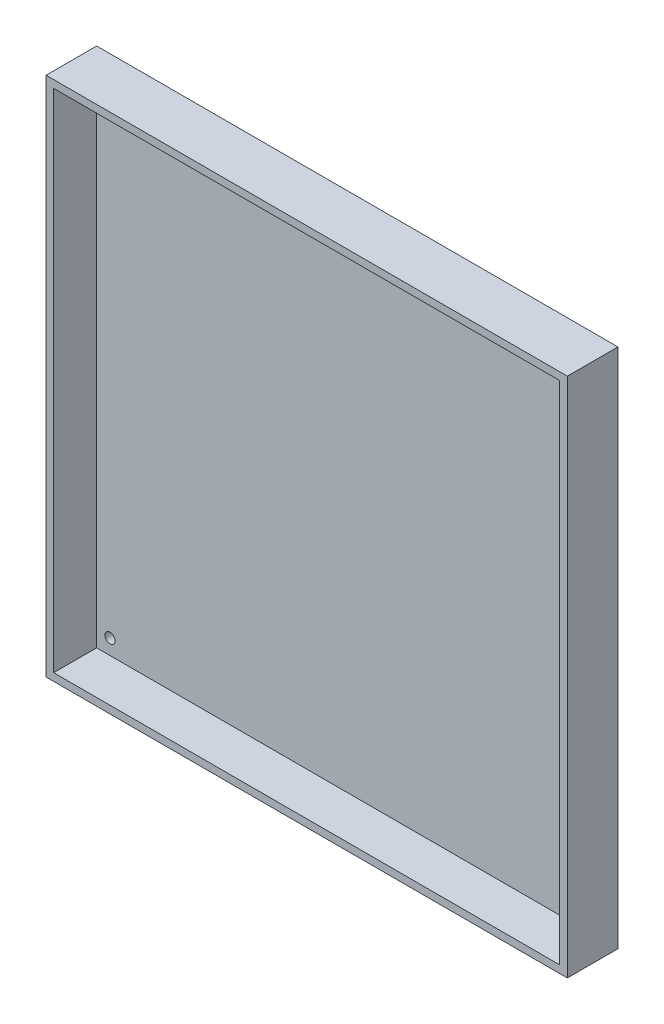
ISO-10303-21;
HEADER;
FILE_DESCRIPTION(('STEP AP214'),'2;1');
FILE_NAME('part.step','',(''),(''),'','','');
FILE_SCHEMA(('AUTOMOTIVE_DESIGN { 1 0 10303 214 1 1 1 1 }'));
ENDSEC;
DATA;
#1=APPLICATION_CONTEXT('core data for automotive mechanical design processes');
#2=APPLICATION_PROTOCOL_DEFINITION('international standard','automotive_design',2000,#1);
#3=PRODUCT_CONTEXT('',#1,'mechanical');
#4=PRODUCT('Part','Part','',(#3));
#5=PRODUCT_RELATED_PRODUCT_CATEGORY('part','',(#4));
#6=PRODUCT_DEFINITION_FORMATION('','',#4);
#7=PRODUCT_DEFINITION_CONTEXT('part definition',#1,'design');
#8=PRODUCT_DEFINITION('design','',#6,#7);
#9=PRODUCT_DEFINITION_SHAPE('','',#8);
#10=(LENGTH_UNIT() NAMED_UNIT(*) SI_UNIT(.MILLI.,.METRE.));
#11=(NAMED_UNIT(*) PLANE_ANGLE_UNIT() SI_UNIT($,.RADIAN.));
#12=(NAMED_UNIT(*) SI_UNIT($,.STERADIAN.) SOLID_ANGLE_UNIT());
#13=UNCERTAINTY_MEASURE_WITH_UNIT(LENGTH_MEASURE(1.E-05),#10,'distance_accuracy_value','');
#14=(GEOMETRIC_REPRESENTATION_CONTEXT(3) GLOBAL_UNCERTAINTY_ASSIGNED_CONTEXT((#13)) GLOBAL_UNIT_ASSIGNED_CONTEXT((#10,
#11,#12)) REPRESENTATION_CONTEXT('',''));
#15=CARTESIAN_POINT('',(0.,0.,0.));
#16=DIRECTION('',(0.,0.,1.));
#17=DIRECTION('',(1.,0.,0.));
#18=AXIS2_PLACEMENT_3D('',#15,#16,#17);
#19=CARTESIAN_POINT('',(0.,-103.,1.5));
#20=DIRECTION('',(1.,0.,0.));
#21=DIRECTION('',(0.,0.,-1.));
#22=AXIS2_PLACEMENT_3D('',#19,#20,#21);
#23=PLANE('',#22);
#24=DIRECTION('',(0.,-1.,0.));
#25=VECTOR('',#24,1.);
#26=CARTESIAN_POINT('',(0.,-103.,0.));
#27=LINE('',#26,#25);
#28=CARTESIAN_POINT('',(0.,0.,0.));
#29=VERTEX_POINT('',#28);
#30=CARTESIAN_POINT('',(0.,-103.,0.));
#31=VERTEX_POINT('',#30);
#32=EDGE_CURVE('E115',#29,#31,#27,.T.);
#33=ORIENTED_EDGE('',*,*,#32,.T.);
#34=DIRECTION('',(0.,0.,-1.));
#35=VECTOR('',#34,1.);
#36=CARTESIAN_POINT('',(0.,-103.,1.5));
#37=LINE('',#36,#35);
#38=CARTESIAN_POINT('',(0.,-103.,10.));
#39=VERTEX_POINT('',#38);
#40=EDGE_CURVE('E11',#39,#31,#37,.T.);
#41=ORIENTED_EDGE('',*,*,#40,.F.);
#42=DIRECTION('',(0.,-1.,0.));
#43=VECTOR('',#42,1.);
#44=CARTESIAN_POINT('',(0.,0.,10.));
#45=LINE('',#44,#43);
#46=CARTESIAN_POINT('',(0.,0.,10.));
#47=VERTEX_POINT('',#46);
#48=EDGE_CURVE('E139',#47,#39,#45,.T.);
#49=ORIENTED_EDGE('',*,*,#48,.F.);
#50=DIRECTION('',(0.,0.,-1.));
#51=VECTOR('',#50,1.);
#52=CARTESIAN_POINT('',(0.,0.,1.5));
#53=LINE('',#52,#51);
#54=EDGE_CURVE('E167',#47,#29,#53,.T.);
#55=ORIENTED_EDGE('',*,*,#54,.T.);
#56=EDGE_LOOP('',(#33,#41,#49,#55));
#57=FACE_BOUND('',#56,.T.);
#58=ADVANCED_FACE('F39',(#57),#23,.F.);
#59=CARTESIAN_POINT('',(103.,-103.,1.5));
#60=DIRECTION('',(0.,1.,0.));
#61=DIRECTION('',(-1.,0.,0.));
#62=AXIS2_PLACEMENT_3D('',#59,#60,#61);
#63=PLANE('',#62);
#64=DIRECTION('',(1.,0.,0.));
#65=VECTOR('',#64,1.);
#66=CARTESIAN_POINT('',(103.,-103.,0.));
#67=LINE('',#66,#65);
#68=CARTESIAN_POINT('',(103.,-103.,0.));
#69=VERTEX_POINT('',#68);
#70=EDGE_CURVE('E162',#31,#69,#67,.T.);
#71=ORIENTED_EDGE('',*,*,#70,.T.);
#72=DIRECTION('',(0.,0.,-1.));
#73=VECTOR('',#72,1.);
#74=CARTESIAN_POINT('',(103.,-103.,1.5));
#75=LINE('',#74,#73);
#76=CARTESIAN_POINT('',(103.,-103.,10.));
#77=VERTEX_POINT('',#76);
#78=EDGE_CURVE('E46',#77,#69,#75,.T.);
#79=ORIENTED_EDGE('',*,*,#78,.F.);
#80=DIRECTION('',(1.,0.,0.));
#81=VECTOR('',#80,1.);
#82=CARTESIAN_POINT('',(0.,-103.,10.));
#83=LINE('',#82,#81);
#84=EDGE_CURVE('E142',#39,#77,#83,.T.);
#85=ORIENTED_EDGE('',*,*,#84,.F.);
#86=ORIENTED_EDGE('',*,*,#40,.T.);
#87=EDGE_LOOP('',(#71,#79,#85,#86));
#88=FACE_BOUND('',#87,.T.);
#89=ADVANCED_FACE('F184',(#88),#63,.F.);
#90=CARTESIAN_POINT('',(103.,0.,1.5));
#91=DIRECTION('',(-1.,0.,0.));
#92=DIRECTION('',(0.,0.,1.));
#93=AXIS2_PLACEMENT_3D('',#90,#91,#92);
#94=PLANE('',#93);
#95=DIRECTION('',(0.,1.,0.));
#96=VECTOR('',#95,1.);
#97=CARTESIAN_POINT('',(103.,0.,0.));
#98=LINE('',#97,#96);
#99=CARTESIAN_POINT('',(103.,0.,0.));
#100=VERTEX_POINT('',#99);
#101=EDGE_CURVE('E164',#69,#100,#98,.T.);
#102=ORIENTED_EDGE('',*,*,#101,.T.);
#103=DIRECTION('',(0.,0.,-1.));
#104=VECTOR('',#103,1.);
#105=CARTESIAN_POINT('',(103.,0.,1.5));
#106=LINE('',#105,#104);
#107=CARTESIAN_POINT('',(103.,0.,10.));
#108=VERTEX_POINT('',#107);
#109=EDGE_CURVE('E169',#108,#100,#106,.T.);
#110=ORIENTED_EDGE('',*,*,#109,.F.);
#111=DIRECTION('',(0.,1.,0.));
#112=VECTOR('',#111,1.);
#113=CARTESIAN_POINT('',(103.,0.,10.));
#114=LINE('',#113,#112);
#115=EDGE_CURVE('E145',#77,#108,#114,.T.);
#116=ORIENTED_EDGE('',*,*,#115,.F.);
#117=ORIENTED_EDGE('',*,*,#78,.T.);
#118=EDGE_LOOP('',(#102,#110,#116,#117));
#119=FACE_BOUND('',#118,.T.);
#120=ADVANCED_FACE('F174',(#119),#94,.F.);
#121=CARTESIAN_POINT('',(0.,0.,1.5));
#122=DIRECTION('',(0.,-1.,0.));
#123=DIRECTION('',(0.,0.,-1.));
#124=AXIS2_PLACEMENT_3D('',#121,#122,#123);
#125=PLANE('',#124);
#126=DIRECTION('',(-1.,0.,0.));
#127=VECTOR('',#126,1.);
#128=CARTESIAN_POINT('',(0.,0.,0.));
#129=LINE('',#128,#127);
#130=EDGE_CURVE('E61',#100,#29,#129,.T.);
#131=ORIENTED_EDGE('',*,*,#130,.T.);
#132=ORIENTED_EDGE('',*,*,#54,.F.);
#133=DIRECTION('',(-1.,0.,0.));
#134=VECTOR('',#133,1.);
#135=CARTESIAN_POINT('',(0.,0.,10.));
#136=LINE('',#135,#134);
#137=EDGE_CURVE('E136',#108,#47,#136,.T.);
#138=ORIENTED_EDGE('',*,*,#137,.F.);
#139=ORIENTED_EDGE('',*,*,#109,.T.);
#140=EDGE_LOOP('',(#131,#132,#138,#139));
#141=FACE_BOUND('',#140,.T.);
#142=ADVANCED_FACE('F183',(#141),#125,.F.);
#143=CARTESIAN_POINT('',(0.,0.,0.));
#144=DIRECTION('',(0.,0.,-1.));
#145=DIRECTION('',(-1.,0.,0.));
#146=AXIS2_PLACEMENT_3D('',#143,#144,#145);
#147=PLANE('',#146);
#148=CARTESIAN_POINT('',(4.5,-4.5,0.));
#149=DIRECTION('',(0.,0.,1.));
#150=DIRECTION('',(1.,0.,0.));
#151=AXIS2_PLACEMENT_3D('',#148,#149,#150);
#152=CIRCLE('',#151,1.);
#153=CARTESIAN_POINT('',(5.5,-4.5,0.));
#154=VERTEX_POINT('',#153);
#155=EDGE_CURVE('E249',#154,#154,#152,.T.);
#156=ORIENTED_EDGE('',*,*,#155,.T.);
#157=EDGE_LOOP('',(#156));
#158=FACE_BOUND('',#157,.T.);
#159=CARTESIAN_POINT('',(98.5,-4.5,0.));
#160=DIRECTION('',(0.,0.,1.));
#161=DIRECTION('',(1.,0.,0.));
#162=AXIS2_PLACEMENT_3D('',#159,#160,#161);
#163=CIRCLE('',#162,0.999999999999998);
#164=CARTESIAN_POINT('',(99.5,-4.5,0.));
#165=VERTEX_POINT('',#164);
#166=EDGE_CURVE('E239',#165,#165,#163,.T.);
#167=ORIENTED_EDGE('',*,*,#166,.T.);
#168=EDGE_LOOP('',(#167));
#169=FACE_BOUND('',#168,.T.);
#170=CARTESIAN_POINT('',(98.5,-98.5,0.));
#171=DIRECTION('',(0.,0.,1.));
#172=DIRECTION('',(1.,0.,0.));
#173=AXIS2_PLACEMENT_3D('',#170,#171,#172);
#174=CIRCLE('',#173,0.999999999999998);
#175=CARTESIAN_POINT('',(99.5,-98.5,0.));
#176=VERTEX_POINT('',#175);
#177=EDGE_CURVE('E234',#176,#176,#174,.T.);
#178=ORIENTED_EDGE('',*,*,#177,.T.);
#179=EDGE_LOOP('',(#178));
#180=FACE_BOUND('',#179,.T.);
#181=CARTESIAN_POINT('',(4.12635577714582,-98.5,0.));
#182=DIRECTION('',(0.,0.,1.));
#183=DIRECTION('',(1.,0.,0.));
#184=AXIS2_PLACEMENT_3D('',#181,#182,#183);
#185=CIRCLE('',#184,1.);
#186=CARTESIAN_POINT('',(5.12635577714582,-98.5,0.));
#187=VERTEX_POINT('',#186);
#188=EDGE_CURVE('E151',#187,#187,#185,.T.);
#189=ORIENTED_EDGE('',*,*,#188,.T.);
#190=EDGE_LOOP('',(#189));
#191=FACE_BOUND('',#190,.T.);
#192=ORIENTED_EDGE('',*,*,#32,.F.);
#193=ORIENTED_EDGE('',*,*,#130,.F.);
#194=ORIENTED_EDGE('',*,*,#101,.F.);
#195=ORIENTED_EDGE('',*,*,#70,.F.);
#196=EDGE_LOOP('',(#192,#193,#194,#195));
#197=FACE_BOUND('',#196,.T.);
#198=ADVANCED_FACE('F179',(#158,#169,#180,#191,#197),#147,.T.);
#199=CARTESIAN_POINT('',(0.,-1.5,10.));
#200=DIRECTION('',(0.,-1.,0.));
#201=DIRECTION('',(0.,0.,-1.));
#202=AXIS2_PLACEMENT_3D('',#199,#200,#201);
#203=PLANE('',#202);
#204=DIRECTION('',(-1.,0.,0.));
#205=VECTOR('',#204,1.);
#206=CARTESIAN_POINT('',(0.,-1.5,1.5));
#207=LINE('',#206,#205);
#208=CARTESIAN_POINT('',(101.5,-1.5,1.5));
#209=VERTEX_POINT('',#208);
#210=CARTESIAN_POINT('',(1.5,-1.5,1.5));
#211=VERTEX_POINT('',#210);
#212=EDGE_CURVE('E110',#209,#211,#207,.T.);
#213=ORIENTED_EDGE('',*,*,#212,.F.);
#214=DIRECTION('',(0.,0.,-1.));
#215=VECTOR('',#214,1.);
#216=CARTESIAN_POINT('',(101.5,-1.5,10.));
#217=LINE('',#216,#215);
#218=CARTESIAN_POINT('',(101.5,-1.5,10.));
#219=VERTEX_POINT('',#218);
#220=EDGE_CURVE('E104',#219,#209,#217,.T.);
#221=ORIENTED_EDGE('',*,*,#220,.F.);
#222=DIRECTION('',(-1.,0.,0.));
#223=VECTOR('',#222,1.);
#224=CARTESIAN_POINT('',(0.,-1.5,10.));
#225=LINE('',#224,#223);
#226=CARTESIAN_POINT('',(1.5,-1.5,10.));
#227=VERTEX_POINT('',#226);
#228=EDGE_CURVE('E107',#219,#227,#225,.T.);
#229=ORIENTED_EDGE('',*,*,#228,.T.);
#230=DIRECTION('',(0.,0.,-1.));
#231=VECTOR('',#230,1.);
#232=CARTESIAN_POINT('',(1.5,-1.5,10.));
#233=LINE('',#232,#231);
#234=EDGE_CURVE('E148',#227,#211,#233,.T.);
#235=ORIENTED_EDGE('',*,*,#234,.T.);
#236=EDGE_LOOP('',(#213,#221,#229,#235));
#237=FACE_BOUND('',#236,.T.);
#238=ADVANCED_FACE('F106',(#237),#203,.T.);
#239=CARTESIAN_POINT('',(101.5,0.,10.));
#240=DIRECTION('',(-1.,0.,0.));
#241=DIRECTION('',(0.,0.,1.));
#242=AXIS2_PLACEMENT_3D('',#239,#240,#241);
#243=PLANE('',#242);
#244=DIRECTION('',(0.,1.,0.));
#245=VECTOR('',#244,1.);
#246=CARTESIAN_POINT('',(101.5,0.,1.5));
#247=LINE('',#246,#245);
#248=CARTESIAN_POINT('',(101.5,-101.5,1.5));
#249=VERTEX_POINT('',#248);
#250=EDGE_CURVE('E150',#249,#209,#247,.T.);
#251=ORIENTED_EDGE('',*,*,#250,.F.);
#252=DIRECTION('',(0.,0.,-1.));
#253=VECTOR('',#252,1.);
#254=CARTESIAN_POINT('',(101.5,-101.5,10.));
#255=LINE('',#254,#253);
#256=CARTESIAN_POINT('',(101.5,-101.5,10.));
#257=VERTEX_POINT('',#256);
#258=EDGE_CURVE('E116',#257,#249,#255,.T.);
#259=ORIENTED_EDGE('',*,*,#258,.F.);
#260=DIRECTION('',(0.,1.,0.));
#261=VECTOR('',#260,1.);
#262=CARTESIAN_POINT('',(101.5,0.,10.));
#263=LINE('',#262,#261);
#264=EDGE_CURVE('E123',#257,#219,#263,.T.);
#265=ORIENTED_EDGE('',*,*,#264,.T.);
#266=ORIENTED_EDGE('',*,*,#220,.T.);
#267=EDGE_LOOP('',(#251,#259,#265,#266));
#268=FACE_BOUND('',#267,.T.);
#269=ADVANCED_FACE('F129',(#268),#243,.T.);
#270=CARTESIAN_POINT('',(0.,-101.5,10.));
#271=DIRECTION('',(0.,1.,0.));
#272=DIRECTION('',(0.,0.,1.));
#273=AXIS2_PLACEMENT_3D('',#270,#271,#272);
#274=PLANE('',#273);
#275=DIRECTION('',(1.,0.,0.));
#276=VECTOR('',#275,1.);
#277=CARTESIAN_POINT('',(0.,-101.5,1.5));
#278=LINE('',#277,#276);
#279=CARTESIAN_POINT('',(1.50000000000001,-101.5,1.5));
#280=VERTEX_POINT('',#279);
#281=EDGE_CURVE('E53',#280,#249,#278,.T.);
#282=ORIENTED_EDGE('',*,*,#281,.F.);
#283=DIRECTION('',(0.,0.,-1.));
#284=VECTOR('',#283,1.);
#285=CARTESIAN_POINT('',(1.50000000000001,-101.5,10.));
#286=LINE('',#285,#284);
#287=CARTESIAN_POINT('',(1.50000000000001,-101.5,10.));
#288=VERTEX_POINT('',#287);
#289=EDGE_CURVE('E157',#288,#280,#286,.T.);
#290=ORIENTED_EDGE('',*,*,#289,.F.);
#291=DIRECTION('',(1.,0.,0.));
#292=VECTOR('',#291,1.);
#293=CARTESIAN_POINT('',(0.,-101.5,10.));
#294=LINE('',#293,#292);
#295=EDGE_CURVE('E130',#288,#257,#294,.T.);
#296=ORIENTED_EDGE('',*,*,#295,.T.);
#297=ORIENTED_EDGE('',*,*,#258,.T.);
#298=EDGE_LOOP('',(#282,#290,#296,#297));
#299=FACE_BOUND('',#298,.T.);
#300=ADVANCED_FACE('F206',(#299),#274,.T.);
#301=CARTESIAN_POINT('',(1.5,0.,10.));
#302=DIRECTION('',(1.,0.,0.));
#303=DIRECTION('',(0.,1.,0.));
#304=AXIS2_PLACEMENT_3D('',#301,#302,#303);
#305=PLANE('',#304);
#306=DIRECTION('',(0.,-1.,0.));
#307=VECTOR('',#306,1.);
#308=CARTESIAN_POINT('',(1.5,0.,1.5));
#309=LINE('',#308,#307);
#310=EDGE_CURVE('E127',#211,#280,#309,.T.);
#311=ORIENTED_EDGE('',*,*,#310,.F.);
#312=ORIENTED_EDGE('',*,*,#234,.F.);
#313=DIRECTION('',(0.,-1.,0.));
#314=VECTOR('',#313,1.);
#315=CARTESIAN_POINT('',(1.5,0.,10.));
#316=LINE('',#315,#314);
#317=EDGE_CURVE('E126',#227,#288,#316,.T.);
#318=ORIENTED_EDGE('',*,*,#317,.T.);
#319=ORIENTED_EDGE('',*,*,#289,.T.);
#320=EDGE_LOOP('',(#311,#312,#318,#319));
#321=FACE_BOUND('',#320,.T.);
#322=ADVANCED_FACE('F209',(#321),#305,.T.);
#323=CARTESIAN_POINT('',(0.,0.,10.));
#324=DIRECTION('',(0.,0.,1.));
#325=DIRECTION('',(1.,0.,0.));
#326=AXIS2_PLACEMENT_3D('',#323,#324,#325);
#327=PLANE('',#326);
#328=ORIENTED_EDGE('',*,*,#228,.F.);
#329=ORIENTED_EDGE('',*,*,#264,.F.);
#330=ORIENTED_EDGE('',*,*,#295,.F.);
#331=ORIENTED_EDGE('',*,*,#317,.F.);
#332=EDGE_LOOP('',(#328,#329,#330,#331));
#333=FACE_BOUND('',#332,.T.);
#334=ORIENTED_EDGE('',*,*,#137,.T.);
#335=ORIENTED_EDGE('',*,*,#48,.T.);
#336=ORIENTED_EDGE('',*,*,#84,.T.);
#337=ORIENTED_EDGE('',*,*,#115,.T.);
#338=EDGE_LOOP('',(#334,#335,#336,#337));
#339=FACE_BOUND('',#338,.T.);
#340=ADVANCED_FACE('F120',(#333,#339),#327,.T.);
#341=CARTESIAN_POINT('',(0.,0.,1.5));
#342=DIRECTION('',(0.,0.,-1.));
#343=DIRECTION('',(-1.,0.,0.));
#344=AXIS2_PLACEMENT_3D('',#341,#342,#343);
#345=PLANE('',#344);
#346=CARTESIAN_POINT('',(4.5,-4.5,1.5));
#347=DIRECTION('',(0.,0.,1.));
#348=DIRECTION('',(1.,0.,0.));
#349=AXIS2_PLACEMENT_3D('',#346,#347,#348);
#350=CIRCLE('',#349,1.);
#351=CARTESIAN_POINT('',(5.5,-4.5,1.5));
#352=VERTEX_POINT('',#351);
#353=EDGE_CURVE('E252',#352,#352,#350,.T.);
#354=ORIENTED_EDGE('',*,*,#353,.F.);
#355=EDGE_LOOP('',(#354));
#356=FACE_BOUND('',#355,.T.);
#357=CARTESIAN_POINT('',(98.5,-4.5,1.5));
#358=DIRECTION('',(0.,0.,1.));
#359=DIRECTION('',(1.,0.,0.));
#360=AXIS2_PLACEMENT_3D('',#357,#358,#359);
#361=CIRCLE('',#360,0.999999999999998);
#362=CARTESIAN_POINT('',(99.5,-4.5,1.5));
#363=VERTEX_POINT('',#362);
#364=EDGE_CURVE('E244',#363,#363,#361,.T.);
#365=ORIENTED_EDGE('',*,*,#364,.F.);
#366=EDGE_LOOP('',(#365));
#367=FACE_BOUND('',#366,.T.);
#368=CARTESIAN_POINT('',(98.5,-98.5,1.5));
#369=DIRECTION('',(0.,0.,1.));
#370=DIRECTION('',(1.,0.,0.));
#371=AXIS2_PLACEMENT_3D('',#368,#369,#370);
#372=CIRCLE('',#371,0.999999999999998);
#373=CARTESIAN_POINT('',(99.5,-98.5,1.5));
#374=VERTEX_POINT('',#373);
#375=EDGE_CURVE('E237',#374,#374,#372,.T.);
#376=ORIENTED_EDGE('',*,*,#375,.F.);
#377=EDGE_LOOP('',(#376));
#378=FACE_BOUND('',#377,.T.);
#379=CARTESIAN_POINT('',(4.12635577714582,-98.5,1.5));
#380=DIRECTION('',(0.,0.,1.));
#381=DIRECTION('',(1.,0.,0.));
#382=AXIS2_PLACEMENT_3D('',#379,#380,#381);
#383=CIRCLE('',#382,1.);
#384=CARTESIAN_POINT('',(5.12635577714582,-98.5,1.5));
#385=VERTEX_POINT('',#384);
#386=EDGE_CURVE('E241',#385,#385,#383,.T.);
#387=ORIENTED_EDGE('',*,*,#386,.F.);
#388=EDGE_LOOP('',(#387));
#389=FACE_BOUND('',#388,.T.);
#390=ORIENTED_EDGE('',*,*,#250,.T.);
#391=ORIENTED_EDGE('',*,*,#212,.T.);
#392=ORIENTED_EDGE('',*,*,#310,.T.);
#393=ORIENTED_EDGE('',*,*,#281,.T.);
#394=EDGE_LOOP('',(#390,#391,#392,#393));
#395=FACE_BOUND('',#394,.T.);
#396=ADVANCED_FACE('F197',(#356,#367,#378,#389,#395),#345,.F.);
#397=CARTESIAN_POINT('',(4.12635577714582,-98.5,0.));
#398=DIRECTION('',(0.,0.,1.));
#399=DIRECTION('',(1.,0.,0.));
#400=AXIS2_PLACEMENT_3D('',#397,#398,#399);
#401=CYLINDRICAL_SURFACE('',#400,1.);
#402=ORIENTED_EDGE('',*,*,#188,.F.);
#403=EDGE_LOOP('',(#402));
#404=FACE_BOUND('',#403,.T.);
#405=ORIENTED_EDGE('',*,*,#386,.T.);
#406=EDGE_LOOP('',(#405));
#407=FACE_BOUND('',#406,.T.);
#408=ADVANCED_FACE('F200',(#404,#407),#401,.F.);
#409=CARTESIAN_POINT('',(98.5,-98.5,0.));
#410=DIRECTION('',(0.,0.,1.));
#411=DIRECTION('',(1.,0.,0.));
#412=AXIS2_PLACEMENT_3D('',#409,#410,#411);
#413=CYLINDRICAL_SURFACE('',#412,0.999999999999998);
#414=ORIENTED_EDGE('',*,*,#177,.F.);
#415=EDGE_LOOP('',(#414));
#416=FACE_BOUND('',#415,.T.);
#417=ORIENTED_EDGE('',*,*,#375,.T.);
#418=EDGE_LOOP('',(#417));
#419=FACE_BOUND('',#418,.T.);
#420=ADVANCED_FACE('F217',(#416,#419),#413,.F.);
#421=CARTESIAN_POINT('',(98.5,-4.5,0.));
#422=DIRECTION('',(0.,0.,1.));
#423=DIRECTION('',(1.,0.,0.));
#424=AXIS2_PLACEMENT_3D('',#421,#422,#423);
#425=CYLINDRICAL_SURFACE('',#424,0.999999999999998);
#426=ORIENTED_EDGE('',*,*,#166,.F.);
#427=EDGE_LOOP('',(#426));
#428=FACE_BOUND('',#427,.T.);
#429=ORIENTED_EDGE('',*,*,#364,.T.);
#430=EDGE_LOOP('',(#429));
#431=FACE_BOUND('',#430,.T.);
#432=ADVANCED_FACE('F222',(#428,#431),#425,.F.);
#433=CARTESIAN_POINT('',(4.5,-4.5,0.));
#434=DIRECTION('',(0.,0.,1.));
#435=DIRECTION('',(1.,0.,0.));
#436=AXIS2_PLACEMENT_3D('',#433,#434,#435);
#437=CYLINDRICAL_SURFACE('',#436,1.);
#438=ORIENTED_EDGE('',*,*,#155,.F.);
#439=EDGE_LOOP('',(#438));
#440=FACE_BOUND('',#439,.T.);
#441=ORIENTED_EDGE('',*,*,#353,.T.);
#442=EDGE_LOOP('',(#441));
#443=FACE_BOUND('',#442,.T.);
#444=ADVANCED_FACE('F219',(#440,#443),#437,.F.);
#445=CLOSED_SHELL('',(#58,#89,#120,#142,#198,#238,#269,#300,#322,#340,#396,#408,#420,#432,#444));
#446=MANIFOLD_SOLID_BREP('B2',#445);
#447=ADVANCED_BREP_SHAPE_REPRESENTATION('',(#18,#446),#14);
#448=SHAPE_DEFINITION_REPRESENTATION(#9,#447);
ENDSEC;
END-ISO-10303-21;
